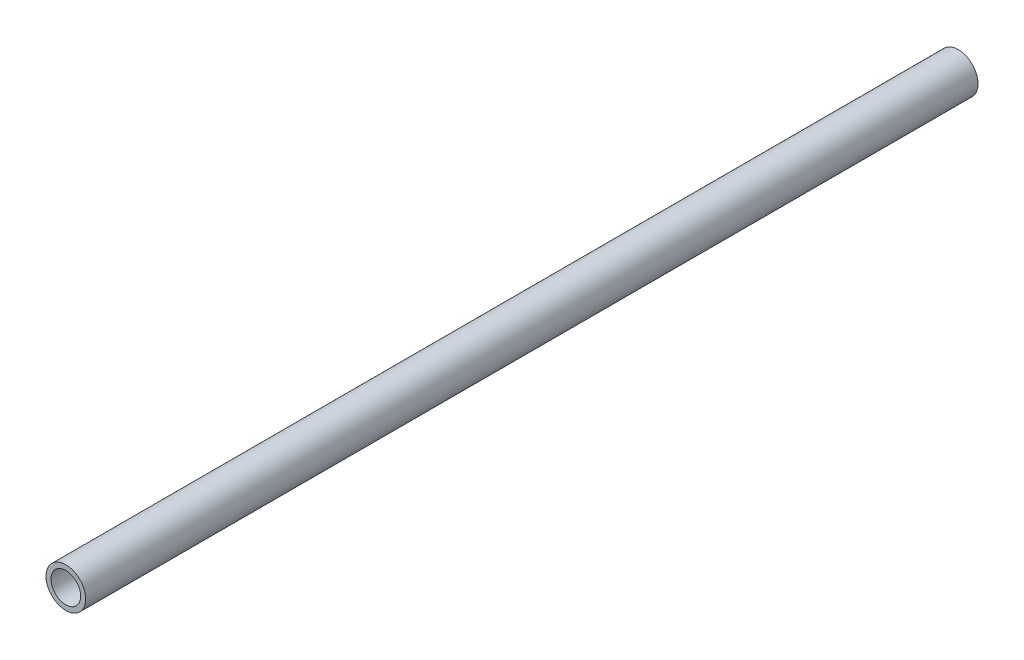
ISO-10303-21;
HEADER;
FILE_DESCRIPTION(('STEP AP214'),'2;1');
FILE_NAME('part.step','',(''),(''),'','','');
FILE_SCHEMA(('AUTOMOTIVE_DESIGN { 1 0 10303 214 1 1 1 1 }'));
ENDSEC;
DATA;
#1=APPLICATION_CONTEXT('core data for automotive mechanical design processes');
#2=APPLICATION_PROTOCOL_DEFINITION('international standard','automotive_design',2000,#1);
#3=PRODUCT_CONTEXT('',#1,'mechanical');
#4=PRODUCT('Part','Part','',(#3));
#5=PRODUCT_RELATED_PRODUCT_CATEGORY('part','',(#4));
#6=PRODUCT_DEFINITION_FORMATION('','',#4);
#7=PRODUCT_DEFINITION_CONTEXT('part definition',#1,'design');
#8=PRODUCT_DEFINITION('design','',#6,#7);
#9=PRODUCT_DEFINITION_SHAPE('','',#8);
#10=(LENGTH_UNIT() NAMED_UNIT(*) SI_UNIT(.MILLI.,.METRE.));
#11=(NAMED_UNIT(*) PLANE_ANGLE_UNIT() SI_UNIT($,.RADIAN.));
#12=(NAMED_UNIT(*) SI_UNIT($,.STERADIAN.) SOLID_ANGLE_UNIT());
#13=UNCERTAINTY_MEASURE_WITH_UNIT(LENGTH_MEASURE(1.E-05),#10,'distance_accuracy_value','');
#14=(GEOMETRIC_REPRESENTATION_CONTEXT(3) GLOBAL_UNCERTAINTY_ASSIGNED_CONTEXT((#13)) GLOBAL_UNIT_ASSIGNED_CONTEXT((#10,
#11,#12)) REPRESENTATION_CONTEXT('',''));
#15=CARTESIAN_POINT('',(0.,0.,0.));
#16=DIRECTION('',(0.,0.,1.));
#17=DIRECTION('',(1.,0.,0.));
#18=AXIS2_PLACEMENT_3D('',#15,#16,#17);
#19=CARTESIAN_POINT('',(0.,0.,180.));
#20=DIRECTION('',(0.,0.,1.));
#21=DIRECTION('',(1.,0.,0.));
#22=AXIS2_PLACEMENT_3D('',#19,#20,#21);
#23=PLANE('',#22);
#24=CARTESIAN_POINT('',(0.,0.,180.));
#25=DIRECTION('',(0.,0.,1.));
#26=DIRECTION('',(1.,0.,0.));
#27=AXIS2_PLACEMENT_3D('',#24,#25,#26);
#28=CIRCLE('',#27,4.);
#29=CARTESIAN_POINT('',(-4.,0.,180.));
#30=VERTEX_POINT('',#29);
#31=EDGE_CURVE('E10',#30,#30,#28,.T.);
#32=ORIENTED_EDGE('',*,*,#31,.T.);
#33=EDGE_LOOP('',(#32));
#34=FACE_BOUND('',#33,.T.);
#35=CARTESIAN_POINT('',(0.,0.,180.));
#36=DIRECTION('',(0.,0.,1.));
#37=DIRECTION('',(1.,0.,0.));
#38=AXIS2_PLACEMENT_3D('',#35,#36,#37);
#39=CIRCLE('',#38,3.);
#40=CARTESIAN_POINT('',(-3.,0.,180.));
#41=VERTEX_POINT('',#40);
#42=EDGE_CURVE('E50',#41,#41,#39,.T.);
#43=ORIENTED_EDGE('',*,*,#42,.F.);
#44=EDGE_LOOP('',(#43));
#45=FACE_BOUND('',#44,.T.);
#46=ADVANCED_FACE('F37',(#34,#45),#23,.T.);
#47=CARTESIAN_POINT('',(0.,0.,0.));
#48=DIRECTION('',(0.,0.,1.));
#49=DIRECTION('',(1.,0.,0.));
#50=AXIS2_PLACEMENT_3D('',#47,#48,#49);
#51=PLANE('',#50);
#52=CARTESIAN_POINT('',(0.,0.,0.));
#53=DIRECTION('',(0.,0.,1.));
#54=DIRECTION('',(1.,0.,0.));
#55=AXIS2_PLACEMENT_3D('',#52,#53,#54);
#56=CIRCLE('',#55,4.);
#57=CARTESIAN_POINT('',(-4.,0.,0.));
#58=VERTEX_POINT('',#57);
#59=EDGE_CURVE('E41',#58,#58,#56,.T.);
#60=ORIENTED_EDGE('',*,*,#59,.F.);
#61=EDGE_LOOP('',(#60));
#62=FACE_BOUND('',#61,.T.);
#63=CARTESIAN_POINT('',(0.,0.,0.));
#64=DIRECTION('',(0.,0.,1.));
#65=DIRECTION('',(1.,0.,0.));
#66=AXIS2_PLACEMENT_3D('',#63,#64,#65);
#67=CIRCLE('',#66,3.);
#68=CARTESIAN_POINT('',(-3.,0.,0.));
#69=VERTEX_POINT('',#68);
#70=EDGE_CURVE('E52',#69,#69,#67,.T.);
#71=ORIENTED_EDGE('',*,*,#70,.T.);
#72=EDGE_LOOP('',(#71));
#73=FACE_BOUND('',#72,.T.);
#74=ADVANCED_FACE('F64',(#62,#73),#51,.F.);
#75=CARTESIAN_POINT('',(0.,0.,180.));
#76=DIRECTION('',(0.,0.,-1.));
#77=DIRECTION('',(-1.,0.,0.));
#78=AXIS2_PLACEMENT_3D('',#75,#76,#77);
#79=CYLINDRICAL_SURFACE('',#78,4.);
#80=CARTESIAN_POINT('',(-4.,0.,180.));
#81=CARTESIAN_POINT('',(-4.,0.,178.125));
#82=CARTESIAN_POINT('',(-4.,0.,176.25));
#83=CARTESIAN_POINT('',(-4.,0.,172.5));
#84=CARTESIAN_POINT('',(-4.,0.,170.625));
#85=CARTESIAN_POINT('',(-4.,0.,166.875));
#86=CARTESIAN_POINT('',(-4.,0.,165.));
#87=CARTESIAN_POINT('',(-4.,0.,161.25));
#88=CARTESIAN_POINT('',(-4.,0.,159.375));
#89=CARTESIAN_POINT('',(-4.,0.,155.625));
#90=CARTESIAN_POINT('',(-4.,0.,153.75));
#91=CARTESIAN_POINT('',(-4.,0.,150.));
#92=CARTESIAN_POINT('',(-4.,0.,148.125));
#93=CARTESIAN_POINT('',(-4.,0.,144.375));
#94=CARTESIAN_POINT('',(-4.,0.,142.5));
#95=CARTESIAN_POINT('',(-4.,0.,138.75));
#96=CARTESIAN_POINT('',(-4.,0.,136.875));
#97=CARTESIAN_POINT('',(-4.,0.,133.125));
#98=CARTESIAN_POINT('',(-4.,0.,131.25));
#99=CARTESIAN_POINT('',(-4.,0.,127.5));
#100=CARTESIAN_POINT('',(-4.,0.,125.625));
#101=CARTESIAN_POINT('',(-4.,0.,121.875));
#102=CARTESIAN_POINT('',(-4.,0.,120.));
#103=CARTESIAN_POINT('',(-4.,0.,116.25));
#104=CARTESIAN_POINT('',(-4.,0.,114.375));
#105=CARTESIAN_POINT('',(-4.,0.,110.625));
#106=CARTESIAN_POINT('',(-4.,0.,108.75));
#107=CARTESIAN_POINT('',(-4.,0.,105.));
#108=CARTESIAN_POINT('',(-4.,0.,103.125));
#109=CARTESIAN_POINT('',(-4.,0.,99.375));
#110=CARTESIAN_POINT('',(-4.,0.,97.5));
#111=CARTESIAN_POINT('',(-4.,0.,93.75));
#112=CARTESIAN_POINT('',(-4.,0.,91.875));
#113=CARTESIAN_POINT('',(-4.,0.,88.125));
#114=CARTESIAN_POINT('',(-4.,0.,86.25));
#115=CARTESIAN_POINT('',(-4.,0.,82.5));
#116=CARTESIAN_POINT('',(-4.,0.,80.625));
#117=CARTESIAN_POINT('',(-4.,0.,76.875));
#118=CARTESIAN_POINT('',(-4.,0.,75.));
#119=CARTESIAN_POINT('',(-4.,0.,71.25));
#120=CARTESIAN_POINT('',(-4.,0.,69.375));
#121=CARTESIAN_POINT('',(-4.,0.,65.625));
#122=CARTESIAN_POINT('',(-4.,0.,63.75));
#123=CARTESIAN_POINT('',(-4.,0.,60.));
#124=CARTESIAN_POINT('',(-4.,0.,58.125));
#125=CARTESIAN_POINT('',(-4.,0.,54.375));
#126=CARTESIAN_POINT('',(-4.,0.,52.5));
#127=CARTESIAN_POINT('',(-4.,0.,48.75));
#128=CARTESIAN_POINT('',(-4.,0.,46.875));
#129=CARTESIAN_POINT('',(-4.,0.,43.125));
#130=CARTESIAN_POINT('',(-4.,0.,41.25));
#131=CARTESIAN_POINT('',(-4.,0.,37.5));
#132=CARTESIAN_POINT('',(-4.,0.,35.625));
#133=CARTESIAN_POINT('',(-4.,0.,31.875));
#134=CARTESIAN_POINT('',(-4.,0.,30.));
#135=CARTESIAN_POINT('',(-4.,0.,26.25));
#136=CARTESIAN_POINT('',(-4.,0.,24.375));
#137=CARTESIAN_POINT('',(-4.,0.,20.625));
#138=CARTESIAN_POINT('',(-4.,0.,18.75));
#139=CARTESIAN_POINT('',(-4.,0.,15.));
#140=CARTESIAN_POINT('',(-4.,0.,13.125));
#141=CARTESIAN_POINT('',(-4.,0.,9.37499999999998));
#142=CARTESIAN_POINT('',(-4.,0.,7.49999999999997));
#143=CARTESIAN_POINT('',(-4.,0.,3.74999999999997));
#144=CARTESIAN_POINT('',(-4.,0.,1.87499999999997));
#145=CARTESIAN_POINT('',(-4.,0.,0.));
#146=B_SPLINE_CURVE_WITH_KNOTS('',3,(#80,#81,#82,#83,#84,#85,#86,#87,#88,#89,#90,#91,#92,#93,
#94,#95,#96,#97,#98,#99,#100,#101,#102,#103,#104,#105,#106,#107,#108,#109,#110,#111,#112,#113,
#114,#115,#116,#117,#118,#119,#120,#121,#122,#123,#124,#125,#126,#127,#128,#129,#130,#131,#132,
#133,#134,#135,#136,#137,#138,#139,#140,#141,#142,#143,#144,#145),.UNSPECIFIED.,.F.,.F.,(4,2,2,
2,2,2,2,2,2,2,2,2,2,2,2,2,2,2,2,2,2,2,2,2,2,2,2,2,2,2,2,2,4),(0.,5.62499999999999,11.25,16.875,
22.5,28.125,33.75,39.375,45.,50.625,56.25,61.875,67.5,73.125,78.75,84.375,90.,95.625,101.25,
106.875,112.5,118.125,123.75,129.375,135.,140.625,146.25,151.875,157.5,163.125,168.75,174.375,
180.),.UNSPECIFIED.);
#147=EDGE_CURVE('BSEAM39',#30,#58,#146,.T.);
#148=ORIENTED_EDGE('',*,*,#31,.F.);
#149=ORIENTED_EDGE('',*,*,#59,.T.);
#150=ORIENTED_EDGE('',*,*,#147,.T.);
#151=ORIENTED_EDGE('',*,*,#147,.F.);
#152=EDGE_LOOP('',(#148,#150,#149,#151));
#153=FACE_BOUND('',#152,.T.);
#154=ADVANCED_FACE('F39',(#153),#79,.T.);
#155=CARTESIAN_POINT('',(0.,0.,180.));
#156=DIRECTION('',(0.,0.,-1.));
#157=DIRECTION('',(-1.,0.,0.));
#158=AXIS2_PLACEMENT_3D('',#155,#156,#157);
#159=CYLINDRICAL_SURFACE('',#158,3.);
#160=CARTESIAN_POINT('',(-3.,0.,180.));
#161=CARTESIAN_POINT('',(-3.,0.,178.125));
#162=CARTESIAN_POINT('',(-3.,0.,176.25));
#163=CARTESIAN_POINT('',(-3.,0.,172.5));
#164=CARTESIAN_POINT('',(-3.,0.,170.625));
#165=CARTESIAN_POINT('',(-3.,0.,166.875));
#166=CARTESIAN_POINT('',(-3.,0.,165.));
#167=CARTESIAN_POINT('',(-3.,0.,161.25));
#168=CARTESIAN_POINT('',(-3.,0.,159.375));
#169=CARTESIAN_POINT('',(-3.,0.,155.625));
#170=CARTESIAN_POINT('',(-3.,0.,153.75));
#171=CARTESIAN_POINT('',(-3.,0.,150.));
#172=CARTESIAN_POINT('',(-3.,0.,148.125));
#173=CARTESIAN_POINT('',(-3.,0.,144.375));
#174=CARTESIAN_POINT('',(-3.,0.,142.5));
#175=CARTESIAN_POINT('',(-3.,0.,138.75));
#176=CARTESIAN_POINT('',(-3.,0.,136.875));
#177=CARTESIAN_POINT('',(-3.,0.,133.125));
#178=CARTESIAN_POINT('',(-3.,0.,131.25));
#179=CARTESIAN_POINT('',(-3.,0.,127.5));
#180=CARTESIAN_POINT('',(-3.,0.,125.625));
#181=CARTESIAN_POINT('',(-3.,0.,121.875));
#182=CARTESIAN_POINT('',(-3.,0.,120.));
#183=CARTESIAN_POINT('',(-3.,0.,116.25));
#184=CARTESIAN_POINT('',(-3.,0.,114.375));
#185=CARTESIAN_POINT('',(-3.,0.,110.625));
#186=CARTESIAN_POINT('',(-3.,0.,108.75));
#187=CARTESIAN_POINT('',(-3.,0.,105.));
#188=CARTESIAN_POINT('',(-3.,0.,103.125));
#189=CARTESIAN_POINT('',(-3.,0.,99.375));
#190=CARTESIAN_POINT('',(-3.,0.,97.5));
#191=CARTESIAN_POINT('',(-3.,0.,93.75));
#192=CARTESIAN_POINT('',(-3.,0.,91.875));
#193=CARTESIAN_POINT('',(-3.,0.,88.125));
#194=CARTESIAN_POINT('',(-3.,0.,86.25));
#195=CARTESIAN_POINT('',(-3.,0.,82.5));
#196=CARTESIAN_POINT('',(-3.,0.,80.625));
#197=CARTESIAN_POINT('',(-3.,0.,76.875));
#198=CARTESIAN_POINT('',(-3.,0.,75.));
#199=CARTESIAN_POINT('',(-3.,0.,71.25));
#200=CARTESIAN_POINT('',(-3.,0.,69.375));
#201=CARTESIAN_POINT('',(-3.,0.,65.625));
#202=CARTESIAN_POINT('',(-3.,0.,63.75));
#203=CARTESIAN_POINT('',(-3.,0.,60.));
#204=CARTESIAN_POINT('',(-3.,0.,58.125));
#205=CARTESIAN_POINT('',(-3.,0.,54.375));
#206=CARTESIAN_POINT('',(-3.,0.,52.5));
#207=CARTESIAN_POINT('',(-3.,0.,48.75));
#208=CARTESIAN_POINT('',(-3.,0.,46.875));
#209=CARTESIAN_POINT('',(-3.,0.,43.125));
#210=CARTESIAN_POINT('',(-3.,0.,41.25));
#211=CARTESIAN_POINT('',(-3.,0.,37.5));
#212=CARTESIAN_POINT('',(-3.,0.,35.625));
#213=CARTESIAN_POINT('',(-3.,0.,31.875));
#214=CARTESIAN_POINT('',(-3.,0.,30.));
#215=CARTESIAN_POINT('',(-3.,0.,26.25));
#216=CARTESIAN_POINT('',(-3.,0.,24.375));
#217=CARTESIAN_POINT('',(-3.,0.,20.625));
#218=CARTESIAN_POINT('',(-3.,0.,18.75));
#219=CARTESIAN_POINT('',(-3.,0.,15.));
#220=CARTESIAN_POINT('',(-3.,0.,13.125));
#221=CARTESIAN_POINT('',(-3.,0.,9.37499999999998));
#222=CARTESIAN_POINT('',(-3.,0.,7.49999999999997));
#223=CARTESIAN_POINT('',(-3.,0.,3.74999999999997));
#224=CARTESIAN_POINT('',(-3.,0.,1.87499999999997));
#225=CARTESIAN_POINT('',(-3.,0.,0.));
#226=B_SPLINE_CURVE_WITH_KNOTS('',3,(#160,#161,#162,#163,#164,#165,#166,#167,#168,#169,#170,
#171,#172,#173,#174,#175,#176,#177,#178,#179,#180,#181,#182,#183,#184,#185,#186,#187,#188,#189,
#190,#191,#192,#193,#194,#195,#196,#197,#198,#199,#200,#201,#202,#203,#204,#205,#206,#207,#208,
#209,#210,#211,#212,#213,#214,#215,#216,#217,#218,#219,#220,#221,#222,#223,#224,#225),
.UNSPECIFIED.,.F.,.F.,(4,2,2,2,2,2,2,2,2,2,2,2,2,2,2,2,2,2,2,2,2,2,2,2,2,2,2,2,2,2,2,2,4),(0.,
5.62500000000002,11.25,16.875,22.5,28.125,33.75,39.375,45.,50.625,56.25,61.875,67.5,73.125,
78.75,84.375,90.,95.625,101.25,106.875,112.5,118.125,123.75,129.375,135.,140.625,146.25,151.875,
157.5,163.125,168.75,174.375,180.),.UNSPECIFIED.);
#227=EDGE_CURVE('BSEAM60',#41,#69,#226,.T.);
#228=ORIENTED_EDGE('',*,*,#42,.T.);
#229=ORIENTED_EDGE('',*,*,#70,.F.);
#230=ORIENTED_EDGE('',*,*,#227,.T.);
#231=ORIENTED_EDGE('',*,*,#227,.F.);
#232=EDGE_LOOP('',(#228,#230,#229,#231));
#233=FACE_BOUND('',#232,.T.);
#234=ADVANCED_FACE('F60',(#233),#159,.F.);
#235=CLOSED_SHELL('',(#46,#74,#154,#234));
#236=MANIFOLD_SOLID_BREP('B2',#235);
#237=ADVANCED_BREP_SHAPE_REPRESENTATION('',(#18,#236),#14);
#238=SHAPE_DEFINITION_REPRESENTATION(#9,#237);
ENDSEC;
END-ISO-10303-21;
